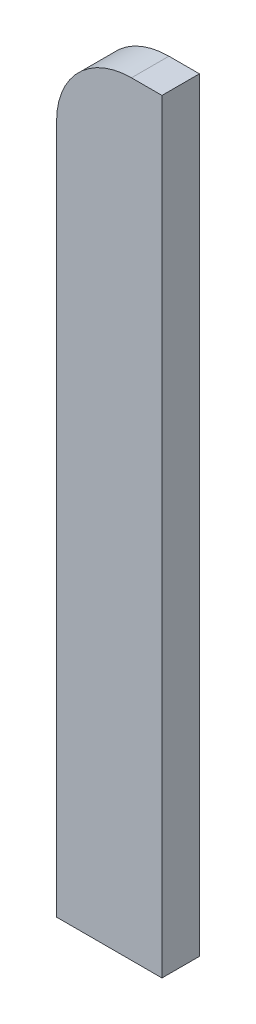
ISO-10303-21;
HEADER;
FILE_DESCRIPTION(('STEP AP214'),'2;1');
FILE_NAME('part.step','',(''),(''),'','','');
FILE_SCHEMA(('AUTOMOTIVE_DESIGN { 1 0 10303 214 1 1 1 1 }'));
ENDSEC;
DATA;
#1=APPLICATION_CONTEXT('core data for automotive mechanical design processes');
#2=APPLICATION_PROTOCOL_DEFINITION('international standard','automotive_design',2000,#1);
#3=PRODUCT_CONTEXT('',#1,'mechanical');
#4=PRODUCT('Part','Part','',(#3));
#5=PRODUCT_RELATED_PRODUCT_CATEGORY('part','',(#4));
#6=PRODUCT_DEFINITION_FORMATION('','',#4);
#7=PRODUCT_DEFINITION_CONTEXT('part definition',#1,'design');
#8=PRODUCT_DEFINITION('design','',#6,#7);
#9=PRODUCT_DEFINITION_SHAPE('','',#8);
#10=(LENGTH_UNIT() NAMED_UNIT(*) SI_UNIT(.MILLI.,.METRE.));
#11=(NAMED_UNIT(*) PLANE_ANGLE_UNIT() SI_UNIT($,.RADIAN.));
#12=(NAMED_UNIT(*) SI_UNIT($,.STERADIAN.) SOLID_ANGLE_UNIT());
#13=UNCERTAINTY_MEASURE_WITH_UNIT(LENGTH_MEASURE(1.E-05),#10,'distance_accuracy_value','');
#14=(GEOMETRIC_REPRESENTATION_CONTEXT(3) GLOBAL_UNCERTAINTY_ASSIGNED_CONTEXT((#13)) GLOBAL_UNIT_ASSIGNED_CONTEXT((#10,
#11,#12)) REPRESENTATION_CONTEXT('',''));
#15=CARTESIAN_POINT('',(0.,0.,0.));
#16=DIRECTION('',(0.,0.,1.));
#17=DIRECTION('',(1.,0.,0.));
#18=AXIS2_PLACEMENT_3D('',#15,#16,#17);
#19=CARTESIAN_POINT('',(7.036,67.481,5.));
#20=DIRECTION('',(0.,1.,0.));
#21=DIRECTION('',(0.,0.,1.));
#22=AXIS2_PLACEMENT_3D('',#19,#20,#21);
#23=PLANE('',#22);
#24=DIRECTION('',(1.,0.,0.));
#25=VECTOR('',#24,1.);
#26=CARTESIAN_POINT('',(7.036,67.481,0.));
#27=LINE('',#26,#25);
#28=CARTESIAN_POINT('',(7.036,67.481,0.));
#29=VERTEX_POINT('',#28);
#30=CARTESIAN_POINT('',(21.108,67.481,0.));
#31=VERTEX_POINT('',#30);
#32=EDGE_CURVE('E102',#29,#31,#27,.T.);
#33=ORIENTED_EDGE('',*,*,#32,.T.);
#34=DIRECTION('',(0.,0.,-1.));
#35=VECTOR('',#34,1.);
#36=CARTESIAN_POINT('',(21.108,67.481,5.));
#37=LINE('',#36,#35);
#38=CARTESIAN_POINT('',(21.108,67.481,5.));
#39=VERTEX_POINT('',#38);
#40=EDGE_CURVE('E84',#39,#31,#37,.T.);
#41=ORIENTED_EDGE('',*,*,#40,.F.);
#42=DIRECTION('',(1.,0.,0.));
#43=VECTOR('',#42,1.);
#44=CARTESIAN_POINT('',(7.036,67.481,5.));
#45=LINE('',#44,#43);
#46=CARTESIAN_POINT('',(7.036,67.481,5.));
#47=VERTEX_POINT('',#46);
#48=EDGE_CURVE('E90',#47,#39,#45,.T.);
#49=ORIENTED_EDGE('',*,*,#48,.F.);
#50=DIRECTION('',(0.,0.,-1.));
#51=VECTOR('',#50,1.);
#52=CARTESIAN_POINT('',(7.036,67.481,5.));
#53=LINE('',#52,#51);
#54=EDGE_CURVE('E107',#47,#29,#53,.T.);
#55=ORIENTED_EDGE('',*,*,#54,.T.);
#56=EDGE_LOOP('',(#33,#41,#49,#55));
#57=FACE_BOUND('',#56,.T.);
#58=ADVANCED_FACE('F33',(#57),#23,.F.);
#59=CARTESIAN_POINT('',(21.108,67.481,5.));
#60=DIRECTION('',(-1.,0.,0.));
#61=DIRECTION('',(0.,0.,1.));
#62=AXIS2_PLACEMENT_3D('',#59,#60,#61);
#63=PLANE('',#62);
#64=DIRECTION('',(0.,1.,0.));
#65=VECTOR('',#64,1.);
#66=CARTESIAN_POINT('',(21.108,67.481,0.));
#67=LINE('',#66,#65);
#68=CARTESIAN_POINT('',(21.108,169.54,0.));
#69=VERTEX_POINT('',#68);
#70=EDGE_CURVE('E115',#31,#69,#67,.T.);
#71=ORIENTED_EDGE('',*,*,#70,.T.);
#72=DIRECTION('',(0.,0.,-1.));
#73=VECTOR('',#72,1.);
#74=CARTESIAN_POINT('',(21.108,169.54,5.));
#75=LINE('',#74,#73);
#76=CARTESIAN_POINT('',(21.108,169.54,5.));
#77=VERTEX_POINT('',#76);
#78=EDGE_CURVE('E87',#77,#69,#75,.T.);
#79=ORIENTED_EDGE('',*,*,#78,.F.);
#80=DIRECTION('',(0.,1.,0.));
#81=VECTOR('',#80,1.);
#82=CARTESIAN_POINT('',(21.108,67.481,5.));
#83=LINE('',#82,#81);
#84=EDGE_CURVE('E80',#39,#77,#83,.T.);
#85=ORIENTED_EDGE('',*,*,#84,.F.);
#86=ORIENTED_EDGE('',*,*,#40,.T.);
#87=EDGE_LOOP('',(#71,#79,#85,#86));
#88=FACE_BOUND('',#87,.T.);
#89=ADVANCED_FACE('F82',(#88),#63,.F.);
#90=CARTESIAN_POINT('',(21.108,169.54,5.));
#91=DIRECTION('',(0.,-1.,0.));
#92=DIRECTION('',(0.,0.,-1.));
#93=AXIS2_PLACEMENT_3D('',#90,#91,#92);
#94=PLANE('',#93);
#95=DIRECTION('',(-1.,0.,0.));
#96=VECTOR('',#95,1.);
#97=CARTESIAN_POINT('',(21.108,169.54,0.));
#98=LINE('',#97,#96);
#99=CARTESIAN_POINT('',(17.036,169.54,0.));
#100=VERTEX_POINT('',#99);
#101=EDGE_CURVE('E113',#69,#100,#98,.T.);
#102=ORIENTED_EDGE('',*,*,#101,.T.);
#103=DIRECTION('',(0.,0.,-1.));
#104=VECTOR('',#103,1.);
#105=CARTESIAN_POINT('',(17.036,169.54,5.));
#106=LINE('',#105,#104);
#107=CARTESIAN_POINT('',(17.036,169.54,5.));
#108=VERTEX_POINT('',#107);
#109=EDGE_CURVE('E41',#100,#108,#106,.F.);
#110=ORIENTED_EDGE('',*,*,#109,.T.);
#111=DIRECTION('',(-1.,0.,0.));
#112=VECTOR('',#111,1.);
#113=CARTESIAN_POINT('',(21.108,169.54,5.));
#114=LINE('',#113,#112);
#115=EDGE_CURVE('E89',#77,#108,#114,.T.);
#116=ORIENTED_EDGE('',*,*,#115,.F.);
#117=ORIENTED_EDGE('',*,*,#78,.T.);
#118=EDGE_LOOP('',(#102,#110,#116,#117));
#119=FACE_BOUND('',#118,.T.);
#120=ADVANCED_FACE('F125',(#119),#94,.F.);
#121=CARTESIAN_POINT('',(7.036,169.54,5.));
#122=DIRECTION('',(1.,0.,0.));
#123=DIRECTION('',(0.,0.,-1.));
#124=AXIS2_PLACEMENT_3D('',#121,#122,#123);
#125=PLANE('',#124);
#126=DIRECTION('',(0.,-1.,0.));
#127=VECTOR('',#126,1.);
#128=CARTESIAN_POINT('',(7.036,169.54,5.));
#129=LINE('',#128,#127);
#130=CARTESIAN_POINT('',(7.036,159.54,5.));
#131=VERTEX_POINT('',#130);
#132=EDGE_CURVE('E95',#131,#47,#129,.T.);
#133=ORIENTED_EDGE('',*,*,#132,.F.);
#134=DIRECTION('',(0.,0.,-1.));
#135=VECTOR('',#134,1.);
#136=CARTESIAN_POINT('',(7.036,159.54,5.));
#137=LINE('',#136,#135);
#138=CARTESIAN_POINT('',(7.036,159.54,0.));
#139=VERTEX_POINT('',#138);
#140=EDGE_CURVE('E103',#131,#139,#137,.T.);
#141=ORIENTED_EDGE('',*,*,#140,.T.);
#142=DIRECTION('',(0.,-1.,0.));
#143=VECTOR('',#142,1.);
#144=CARTESIAN_POINT('',(7.036,169.54,0.));
#145=LINE('',#144,#143);
#146=EDGE_CURVE('E99',#139,#29,#145,.T.);
#147=ORIENTED_EDGE('',*,*,#146,.T.);
#148=ORIENTED_EDGE('',*,*,#54,.F.);
#149=EDGE_LOOP('',(#133,#141,#147,#148));
#150=FACE_BOUND('',#149,.T.);
#151=ADVANCED_FACE('F123',(#150),#125,.F.);
#152=CARTESIAN_POINT('',(0.,0.,5.));
#153=DIRECTION('',(0.,0.,1.));
#154=DIRECTION('',(1.,0.,0.));
#155=AXIS2_PLACEMENT_3D('',#152,#153,#154);
#156=PLANE('',#155);
#157=ORIENTED_EDGE('',*,*,#115,.T.);
#158=CARTESIAN_POINT('',(17.036,159.54,5.));
#159=DIRECTION('',(0.,0.,1.));
#160=DIRECTION('',(1.,0.,0.));
#161=AXIS2_PLACEMENT_3D('',#158,#159,#160);
#162=CIRCLE('',#161,10.);
#163=EDGE_CURVE('E11',#108,#131,#162,.T.);
#164=ORIENTED_EDGE('',*,*,#163,.T.);
#165=ORIENTED_EDGE('',*,*,#132,.T.);
#166=ORIENTED_EDGE('',*,*,#48,.T.);
#167=ORIENTED_EDGE('',*,*,#84,.T.);
#168=EDGE_LOOP('',(#157,#164,#165,#166,#167));
#169=FACE_BOUND('',#168,.T.);
#170=ADVANCED_FACE('F93',(#169),#156,.T.);
#171=CARTESIAN_POINT('',(0.,0.,0.));
#172=DIRECTION('',(0.,0.,1.));
#173=DIRECTION('',(1.,0.,0.));
#174=AXIS2_PLACEMENT_3D('',#171,#172,#173);
#175=PLANE('',#174);
#176=ORIENTED_EDGE('',*,*,#146,.F.);
#177=CARTESIAN_POINT('',(17.036,159.54,0.));
#178=DIRECTION('',(0.,0.,1.));
#179=DIRECTION('',(1.,0.,0.));
#180=AXIS2_PLACEMENT_3D('',#177,#178,#179);
#181=CIRCLE('',#180,10.);
#182=EDGE_CURVE('E55',#139,#100,#181,.F.);
#183=ORIENTED_EDGE('',*,*,#182,.T.);
#184=ORIENTED_EDGE('',*,*,#101,.F.);
#185=ORIENTED_EDGE('',*,*,#70,.F.);
#186=ORIENTED_EDGE('',*,*,#32,.F.);
#187=EDGE_LOOP('',(#176,#183,#184,#185,#186));
#188=FACE_BOUND('',#187,.T.);
#189=ADVANCED_FACE('F124',(#188),#175,.F.);
#190=CARTESIAN_POINT('',(17.036,159.54,5.));
#191=DIRECTION('',(0.,0.,-1.));
#192=DIRECTION('',(-1.,0.,0.));
#193=AXIS2_PLACEMENT_3D('',#190,#191,#192);
#194=CYLINDRICAL_SURFACE('',#193,10.);
#195=ORIENTED_EDGE('',*,*,#163,.F.);
#196=ORIENTED_EDGE('',*,*,#109,.F.);
#197=ORIENTED_EDGE('',*,*,#182,.F.);
#198=ORIENTED_EDGE('',*,*,#140,.F.);
#199=EDGE_LOOP('',(#195,#196,#197,#198));
#200=FACE_BOUND('',#199,.T.);
#201=ADVANCED_FACE('F35',(#200),#194,.T.);
#202=CLOSED_SHELL('',(#58,#89,#120,#151,#170,#189,#201));
#203=MANIFOLD_SOLID_BREP('B2',#202);
#204=ADVANCED_BREP_SHAPE_REPRESENTATION('',(#18,#203),#14);
#205=SHAPE_DEFINITION_REPRESENTATION(#9,#204);
ENDSEC;
END-ISO-10303-21;
